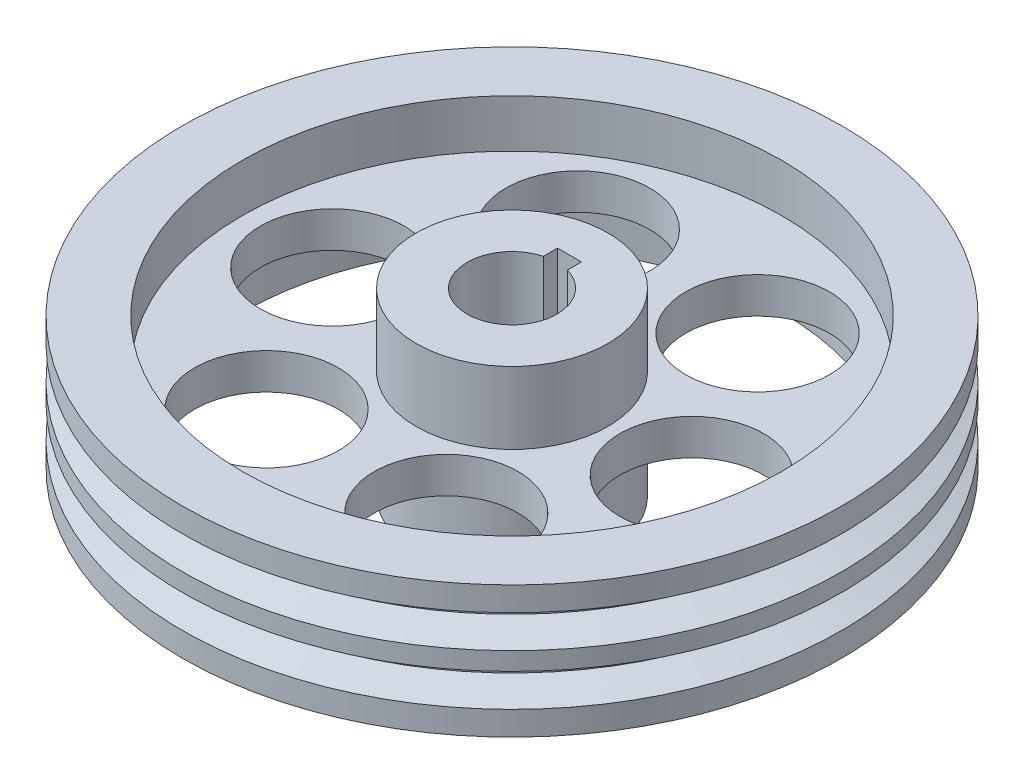
ISO-10303-21;
HEADER;
FILE_DESCRIPTION(('STEP AP214'),'2;1');
FILE_NAME('part.step','',(''),(''),'','','');
FILE_SCHEMA(('AUTOMOTIVE_DESIGN { 1 0 10303 214 1 1 1 1 }'));
ENDSEC;
DATA;
#1=APPLICATION_CONTEXT('core data for automotive mechanical design processes');
#2=APPLICATION_PROTOCOL_DEFINITION('international standard','automotive_design',2000,#1);
#3=PRODUCT_CONTEXT('',#1,'mechanical');
#4=PRODUCT('Part','Part','',(#3));
#5=PRODUCT_RELATED_PRODUCT_CATEGORY('part','',(#4));
#6=PRODUCT_DEFINITION_FORMATION('','',#4);
#7=PRODUCT_DEFINITION_CONTEXT('part definition',#1,'design');
#8=PRODUCT_DEFINITION('design','',#6,#7);
#9=PRODUCT_DEFINITION_SHAPE('','',#8);
#10=(LENGTH_UNIT() NAMED_UNIT(*) SI_UNIT(.MILLI.,.METRE.));
#11=(NAMED_UNIT(*) PLANE_ANGLE_UNIT() SI_UNIT($,.RADIAN.));
#12=(NAMED_UNIT(*) SI_UNIT($,.STERADIAN.) SOLID_ANGLE_UNIT());
#13=UNCERTAINTY_MEASURE_WITH_UNIT(LENGTH_MEASURE(1.E-05),#10,'distance_accuracy_value','');
#14=(GEOMETRIC_REPRESENTATION_CONTEXT(3) GLOBAL_UNCERTAINTY_ASSIGNED_CONTEXT((#13)) GLOBAL_UNIT_ASSIGNED_CONTEXT((#10,
#11,#12)) REPRESENTATION_CONTEXT('',''));
#15=CARTESIAN_POINT('',(0.,0.,0.));
#16=DIRECTION('',(0.,0.,1.));
#17=DIRECTION('',(1.,0.,0.));
#18=AXIS2_PLACEMENT_3D('',#15,#16,#17);
#19=CARTESIAN_POINT('',(0.,11.,0.));
#20=DIRECTION('',(0.,-1.,0.));
#21=DIRECTION('',(0.,0.,-1.));
#22=AXIS2_PLACEMENT_3D('',#19,#20,#21);
#23=CYLINDRICAL_SURFACE('',#22,55.);
#24=CARTESIAN_POINT('',(0.,11.,0.));
#25=DIRECTION('',(0.,1.,0.));
#26=DIRECTION('',(0.,0.,1.));
#27=AXIS2_PLACEMENT_3D('',#24,#25,#26);
#28=CIRCLE('',#27,55.);
#29=CARTESIAN_POINT('',(0.,11.,55.));
#30=VERTEX_POINT('',#29);
#31=EDGE_CURVE('E298',#30,#30,#28,.T.);
#32=ORIENTED_EDGE('',*,*,#31,.F.);
#33=EDGE_LOOP('',(#32));
#34=FACE_BOUND('',#33,.T.);
#35=CARTESIAN_POINT('',(0.,6.98516846383476,0.));
#36=DIRECTION('',(0.,-1.,0.));
#37=DIRECTION('',(0.,0.,-1.));
#38=AXIS2_PLACEMENT_3D('',#35,#36,#37);
#39=CIRCLE('',#38,55.);
#40=CARTESIAN_POINT('',(0.,6.98516846383476,-55.));
#41=VERTEX_POINT('',#40);
#42=EDGE_CURVE('E294',#41,#41,#39,.T.);
#43=ORIENTED_EDGE('',*,*,#42,.F.);
#44=EDGE_LOOP('',(#43));
#45=FACE_BOUND('',#44,.T.);
#46=ADVANCED_FACE('F77',(#34,#45),#23,.T.);
#47=CARTESIAN_POINT('',(0.,-11.,0.));
#48=DIRECTION('',(0.,1.,0.));
#49=DIRECTION('',(0.,0.,1.));
#50=AXIS2_PLACEMENT_3D('',#47,#48,#49);
#51=CIRCLE('',#50,55.);
#52=CARTESIAN_POINT('',(0.,-11.,55.));
#53=VERTEX_POINT('',#52);
#54=EDGE_CURVE('E296',#53,#53,#51,.T.);
#55=ORIENTED_EDGE('',*,*,#54,.T.);
#56=EDGE_LOOP('',(#55));
#57=FACE_BOUND('',#56,.T.);
#58=CARTESIAN_POINT('',(0.,-6.98516846383476,0.));
#59=DIRECTION('',(0.,-1.,0.));
#60=DIRECTION('',(0.,0.,-1.));
#61=AXIS2_PLACEMENT_3D('',#58,#59,#60);
#62=CIRCLE('',#61,55.);
#63=CARTESIAN_POINT('',(0.,-6.98516846383476,-55.));
#64=VERTEX_POINT('',#63);
#65=EDGE_CURVE('E284',#64,#64,#62,.T.);
#66=ORIENTED_EDGE('',*,*,#65,.T.);
#67=EDGE_LOOP('',(#66));
#68=FACE_BOUND('',#67,.T.);
#69=ADVANCED_FACE('F239',(#57,#68),#23,.T.);
#70=CARTESIAN_POINT('',(0.,15.,0.));
#71=DIRECTION('',(0.,-1.,0.));
#72=DIRECTION('',(0.,0.,-1.));
#73=AXIS2_PLACEMENT_3D('',#70,#71,#72);
#74=CYLINDRICAL_SURFACE('',#73,7.5);
#75=CARTESIAN_POINT('',(0.,3.,0.));
#76=DIRECTION('',(0.,1.,0.));
#77=DIRECTION('',(0.,0.,1.));
#78=AXIS2_PLACEMENT_3D('',#75,#76,#77);
#79=CIRCLE('',#78,7.5);
#80=CARTESIAN_POINT('',(-2.,3.,-7.22841614740048));
#81=VERTEX_POINT('',#80);
#82=CARTESIAN_POINT('',(2.,3.,-7.22841614740048));
#83=VERTEX_POINT('',#82);
#84=EDGE_CURVE('E181',#81,#83,#79,.T.);
#85=ORIENTED_EDGE('',*,*,#84,.F.);
#86=DIRECTION('',(0.,-1.,0.));
#87=VECTOR('',#86,1.);
#88=CARTESIAN_POINT('',(-2.,15.,-7.22841614740048));
#89=LINE('',#88,#87);
#90=CARTESIAN_POINT('',(-2.,15.,-7.22841614740048));
#91=VERTEX_POINT('',#90);
#92=EDGE_CURVE('E86',#91,#81,#89,.T.);
#93=ORIENTED_EDGE('',*,*,#92,.F.);
#94=CARTESIAN_POINT('',(0.,15.,0.));
#95=DIRECTION('',(0.,1.,0.));
#96=DIRECTION('',(0.,0.,1.));
#97=AXIS2_PLACEMENT_3D('',#94,#95,#96);
#98=CIRCLE('',#97,7.5);
#99=CARTESIAN_POINT('',(2.,15.,-7.22841614740048));
#100=VERTEX_POINT('',#99);
#101=EDGE_CURVE('E184',#91,#100,#98,.T.);
#102=ORIENTED_EDGE('',*,*,#101,.T.);
#103=DIRECTION('',(0.,-1.,0.));
#104=VECTOR('',#103,1.);
#105=CARTESIAN_POINT('',(2.,15.,-7.22841614740048));
#106=LINE('',#105,#104);
#107=EDGE_CURVE('E153',#100,#83,#106,.T.);
#108=ORIENTED_EDGE('',*,*,#107,.T.);
#109=EDGE_LOOP('',(#85,#93,#102,#108));
#110=FACE_BOUND('',#109,.T.);
#111=ADVANCED_FACE('F79',(#110),#74,.F.);
#112=CARTESIAN_POINT('',(-2.,15.,0.));
#113=DIRECTION('',(-1.,0.,0.));
#114=DIRECTION('',(0.,0.,1.));
#115=AXIS2_PLACEMENT_3D('',#112,#113,#114);
#116=PLANE('',#115);
#117=ORIENTED_EDGE('',*,*,#92,.T.);
#118=DIRECTION('',(0.,0.,-1.));
#119=VECTOR('',#118,1.);
#120=CARTESIAN_POINT('',(-2.,3.,0.));
#121=LINE('',#120,#119);
#122=CARTESIAN_POINT('',(-2.,3.,-9.6));
#123=VERTEX_POINT('',#122);
#124=EDGE_CURVE('E178',#81,#123,#121,.T.);
#125=ORIENTED_EDGE('',*,*,#124,.T.);
#126=DIRECTION('',(0.,-1.,0.));
#127=VECTOR('',#126,1.);
#128=CARTESIAN_POINT('',(-2.,15.,-9.6));
#129=LINE('',#128,#127);
#130=CARTESIAN_POINT('',(-2.,15.,-9.6));
#131=VERTEX_POINT('',#130);
#132=EDGE_CURVE('E212',#131,#123,#129,.T.);
#133=ORIENTED_EDGE('',*,*,#132,.F.);
#134=DIRECTION('',(0.,0.,-1.));
#135=VECTOR('',#134,1.);
#136=CARTESIAN_POINT('',(-2.,15.,0.));
#137=LINE('',#136,#135);
#138=EDGE_CURVE('E187',#91,#131,#137,.T.);
#139=ORIENTED_EDGE('',*,*,#138,.F.);
#140=EDGE_LOOP('',(#117,#125,#133,#139));
#141=FACE_BOUND('',#140,.T.);
#142=ADVANCED_FACE('F232',(#141),#116,.F.);
#143=CARTESIAN_POINT('',(0.,15.,-9.6));
#144=DIRECTION('',(0.,0.,-1.));
#145=DIRECTION('',(-1.,0.,0.));
#146=AXIS2_PLACEMENT_3D('',#143,#144,#145);
#147=PLANE('',#146);
#148=ORIENTED_EDGE('',*,*,#132,.T.);
#149=DIRECTION('',(1.,0.,0.));
#150=VECTOR('',#149,1.);
#151=CARTESIAN_POINT('',(0.,3.,-9.6));
#152=LINE('',#151,#150);
#153=CARTESIAN_POINT('',(2.,3.,-9.6));
#154=VERTEX_POINT('',#153);
#155=EDGE_CURVE('E175',#123,#154,#152,.T.);
#156=ORIENTED_EDGE('',*,*,#155,.T.);
#157=DIRECTION('',(0.,-1.,0.));
#158=VECTOR('',#157,1.);
#159=CARTESIAN_POINT('',(2.,15.,-9.6));
#160=LINE('',#159,#158);
#161=CARTESIAN_POINT('',(2.,15.,-9.6));
#162=VERTEX_POINT('',#161);
#163=EDGE_CURVE('E208',#162,#154,#160,.T.);
#164=ORIENTED_EDGE('',*,*,#163,.F.);
#165=DIRECTION('',(1.,0.,0.));
#166=VECTOR('',#165,1.);
#167=CARTESIAN_POINT('',(0.,15.,-9.6));
#168=LINE('',#167,#166);
#169=EDGE_CURVE('E190',#131,#162,#168,.T.);
#170=ORIENTED_EDGE('',*,*,#169,.F.);
#171=EDGE_LOOP('',(#148,#156,#164,#170));
#172=FACE_BOUND('',#171,.T.);
#173=ADVANCED_FACE('F227',(#172),#147,.F.);
#174=CARTESIAN_POINT('',(2.,15.,0.));
#175=DIRECTION('',(1.,0.,0.));
#176=DIRECTION('',(0.,0.,-1.));
#177=AXIS2_PLACEMENT_3D('',#174,#175,#176);
#178=PLANE('',#177);
#179=ORIENTED_EDGE('',*,*,#163,.T.);
#180=DIRECTION('',(0.,0.,1.));
#181=VECTOR('',#180,1.);
#182=CARTESIAN_POINT('',(2.,3.,0.));
#183=LINE('',#182,#181);
#184=EDGE_CURVE('E172',#154,#83,#183,.T.);
#185=ORIENTED_EDGE('',*,*,#184,.T.);
#186=ORIENTED_EDGE('',*,*,#107,.F.);
#187=DIRECTION('',(0.,0.,1.));
#188=VECTOR('',#187,1.);
#189=CARTESIAN_POINT('',(2.,15.,0.));
#190=LINE('',#189,#188);
#191=EDGE_CURVE('E192',#162,#100,#190,.T.);
#192=ORIENTED_EDGE('',*,*,#191,.F.);
#193=EDGE_LOOP('',(#179,#185,#186,#192));
#194=FACE_BOUND('',#193,.T.);
#195=ADVANCED_FACE('F235',(#194),#178,.F.);
#196=CARTESIAN_POINT('',(0.,15.,0.));
#197=DIRECTION('',(0.,-1.,0.));
#198=DIRECTION('',(0.,0.,-1.));
#199=AXIS2_PLACEMENT_3D('',#196,#197,#198);
#200=CYLINDRICAL_SURFACE('',#199,16.);
#201=CARTESIAN_POINT('',(0.,3.,0.));
#202=DIRECTION('',(0.,1.,0.));
#203=DIRECTION('',(0.,0.,1.));
#204=AXIS2_PLACEMENT_3D('',#201,#202,#203);
#205=CIRCLE('',#204,16.);
#206=CARTESIAN_POINT('',(0.,3.,16.));
#207=VERTEX_POINT('',#206);
#208=EDGE_CURVE('E81',#207,#207,#205,.T.);
#209=ORIENTED_EDGE('',*,*,#208,.T.);
#210=EDGE_LOOP('',(#209));
#211=FACE_BOUND('',#210,.T.);
#212=CARTESIAN_POINT('',(0.,15.,0.));
#213=DIRECTION('',(0.,1.,0.));
#214=DIRECTION('',(0.,0.,1.));
#215=AXIS2_PLACEMENT_3D('',#212,#213,#214);
#216=CIRCLE('',#215,16.);
#217=CARTESIAN_POINT('',(0.,15.,16.));
#218=VERTEX_POINT('',#217);
#219=EDGE_CURVE('E154',#218,#218,#216,.T.);
#220=ORIENTED_EDGE('',*,*,#219,.F.);
#221=EDGE_LOOP('',(#220));
#222=FACE_BOUND('',#221,.T.);
#223=ADVANCED_FACE('F368',(#211,#222),#200,.T.);
#224=CARTESIAN_POINT('',(0.,15.,0.));
#225=DIRECTION('',(0.,1.,0.));
#226=DIRECTION('',(0.,0.,1.));
#227=AXIS2_PLACEMENT_3D('',#224,#225,#226);
#228=PLANE('',#227);
#229=ORIENTED_EDGE('',*,*,#101,.F.);
#230=ORIENTED_EDGE('',*,*,#138,.T.);
#231=ORIENTED_EDGE('',*,*,#169,.T.);
#232=ORIENTED_EDGE('',*,*,#191,.T.);
#233=EDGE_LOOP('',(#229,#230,#231,#232));
#234=FACE_BOUND('',#233,.T.);
#235=ORIENTED_EDGE('',*,*,#219,.T.);
#236=EDGE_LOOP('',(#235));
#237=FACE_BOUND('',#236,.T.);
#238=ADVANCED_FACE('F364',(#234,#237),#228,.T.);
#239=CARTESIAN_POINT('',(15.0000000000001,3.,-25.9807621135331));
#240=DIRECTION('',(0.,-1.,0.));
#241=DIRECTION('',(0.,0.,-1.));
#242=AXIS2_PLACEMENT_3D('',#239,#240,#241);
#243=CYLINDRICAL_SURFACE('',#242,12.);
#244=CARTESIAN_POINT('',(15.0000000000001,3.,-25.9807621135331));
#245=DIRECTION('',(0.,1.,0.));
#246=DIRECTION('',(0.,0.,1.));
#247=AXIS2_PLACEMENT_3D('',#244,#245,#246);
#248=CIRCLE('',#247,12.);
#249=CARTESIAN_POINT('',(15.0000000000001,3.,-13.9807621135331));
#250=VERTEX_POINT('',#249);
#251=EDGE_CURVE('E307',#250,#250,#248,.T.);
#252=ORIENTED_EDGE('',*,*,#251,.T.);
#253=EDGE_LOOP('',(#252));
#254=FACE_BOUND('',#253,.T.);
#255=CARTESIAN_POINT('',(15.0000000000001,-3.,-25.9807621135331));
#256=DIRECTION('',(0.,1.,0.));
#257=DIRECTION('',(0.,0.,1.));
#258=AXIS2_PLACEMENT_3D('',#255,#256,#257);
#259=CIRCLE('',#258,12.);
#260=CARTESIAN_POINT('',(15.0000000000001,-3.,-13.9807621135331));
#261=VERTEX_POINT('',#260);
#262=EDGE_CURVE('E306',#261,#261,#259,.T.);
#263=ORIENTED_EDGE('',*,*,#262,.F.);
#264=EDGE_LOOP('',(#263));
#265=FACE_BOUND('',#264,.T.);
#266=ADVANCED_FACE('F367',(#254,#265),#243,.F.);
#267=CARTESIAN_POINT('',(30.,3.,2.09488880330588E-13));
#268=DIRECTION('',(0.,-1.,0.));
#269=DIRECTION('',(0.,0.,-1.));
#270=AXIS2_PLACEMENT_3D('',#267,#268,#269);
#271=CYLINDRICAL_SURFACE('',#270,12.);
#272=CARTESIAN_POINT('',(30.,3.,2.09488880330588E-13));
#273=DIRECTION('',(0.,1.,0.));
#274=DIRECTION('',(0.,0.,1.));
#275=AXIS2_PLACEMENT_3D('',#272,#273,#274);
#276=CIRCLE('',#275,12.);
#277=CARTESIAN_POINT('',(30.,3.,12.0000000000002));
#278=VERTEX_POINT('',#277);
#279=EDGE_CURVE('E313',#278,#278,#276,.T.);
#280=ORIENTED_EDGE('',*,*,#279,.T.);
#281=EDGE_LOOP('',(#280));
#282=FACE_BOUND('',#281,.T.);
#283=CARTESIAN_POINT('',(30.,-3.,2.09488880330588E-13));
#284=DIRECTION('',(0.,1.,0.));
#285=DIRECTION('',(0.,0.,1.));
#286=AXIS2_PLACEMENT_3D('',#283,#284,#285);
#287=CIRCLE('',#286,12.);
#288=CARTESIAN_POINT('',(30.,-3.,12.0000000000002));
#289=VERTEX_POINT('',#288);
#290=EDGE_CURVE('E310',#289,#289,#287,.T.);
#291=ORIENTED_EDGE('',*,*,#290,.F.);
#292=EDGE_LOOP('',(#291));
#293=FACE_BOUND('',#292,.T.);
#294=ADVANCED_FACE('F592',(#282,#293),#271,.F.);
#295=CARTESIAN_POINT('',(14.9999999999998,3.,25.9807621135333));
#296=DIRECTION('',(0.,-1.,0.));
#297=DIRECTION('',(0.,0.,-1.));
#298=AXIS2_PLACEMENT_3D('',#295,#296,#297);
#299=CYLINDRICAL_SURFACE('',#298,12.);
#300=CARTESIAN_POINT('',(14.9999999999998,3.,25.9807621135333));
#301=DIRECTION('',(0.,1.,0.));
#302=DIRECTION('',(0.,0.,1.));
#303=AXIS2_PLACEMENT_3D('',#300,#301,#302);
#304=CIRCLE('',#303,12.);
#305=CARTESIAN_POINT('',(14.9999999999998,3.,37.9807621135333));
#306=VERTEX_POINT('',#305);
#307=EDGE_CURVE('E319',#306,#306,#304,.T.);
#308=ORIENTED_EDGE('',*,*,#307,.T.);
#309=EDGE_LOOP('',(#308));
#310=FACE_BOUND('',#309,.T.);
#311=CARTESIAN_POINT('',(14.9999999999998,-3.,25.9807621135333));
#312=DIRECTION('',(0.,1.,0.));
#313=DIRECTION('',(0.,0.,1.));
#314=AXIS2_PLACEMENT_3D('',#311,#312,#313);
#315=CIRCLE('',#314,12.);
#316=CARTESIAN_POINT('',(14.9999999999998,-3.,37.9807621135333));
#317=VERTEX_POINT('',#316);
#318=EDGE_CURVE('E316',#317,#317,#315,.T.);
#319=ORIENTED_EDGE('',*,*,#318,.F.);
#320=EDGE_LOOP('',(#319));
#321=FACE_BOUND('',#320,.T.);
#322=ADVANCED_FACE('F583',(#310,#321),#299,.F.);
#323=CARTESIAN_POINT('',(-15.0000000000003,3.,25.980762113533));
#324=DIRECTION('',(0.,-1.,0.));
#325=DIRECTION('',(0.,0.,-1.));
#326=AXIS2_PLACEMENT_3D('',#323,#324,#325);
#327=CYLINDRICAL_SURFACE('',#326,12.);
#328=CARTESIAN_POINT('',(-15.0000000000003,3.,25.980762113533));
#329=DIRECTION('',(0.,1.,0.));
#330=DIRECTION('',(0.,0.,1.));
#331=AXIS2_PLACEMENT_3D('',#328,#329,#330);
#332=CIRCLE('',#331,12.);
#333=CARTESIAN_POINT('',(-15.0000000000003,3.,37.980762113533));
#334=VERTEX_POINT('',#333);
#335=EDGE_CURVE('E325',#334,#334,#332,.T.);
#336=ORIENTED_EDGE('',*,*,#335,.T.);
#337=EDGE_LOOP('',(#336));
#338=FACE_BOUND('',#337,.T.);
#339=CARTESIAN_POINT('',(-15.0000000000003,-3.,25.980762113533));
#340=DIRECTION('',(0.,1.,0.));
#341=DIRECTION('',(0.,0.,1.));
#342=AXIS2_PLACEMENT_3D('',#339,#340,#341);
#343=CIRCLE('',#342,12.);
#344=CARTESIAN_POINT('',(-15.0000000000003,-3.,37.980762113533));
#345=VERTEX_POINT('',#344);
#346=EDGE_CURVE('E322',#345,#345,#343,.T.);
#347=ORIENTED_EDGE('',*,*,#346,.F.);
#348=EDGE_LOOP('',(#347));
#349=FACE_BOUND('',#348,.T.);
#350=ADVANCED_FACE('F355',(#338,#349),#327,.F.);
#351=CARTESIAN_POINT('',(-14.9999999999999,3.,-25.9807621135332));
#352=DIRECTION('',(0.,-1.,0.));
#353=DIRECTION('',(0.,0.,-1.));
#354=AXIS2_PLACEMENT_3D('',#351,#352,#353);
#355=CYLINDRICAL_SURFACE('',#354,12.);
#356=CARTESIAN_POINT('',(-14.9999999999999,3.,-25.9807621135332));
#357=DIRECTION('',(0.,1.,0.));
#358=DIRECTION('',(0.,0.,1.));
#359=AXIS2_PLACEMENT_3D('',#356,#357,#358);
#360=CIRCLE('',#359,12.);
#361=CARTESIAN_POINT('',(-14.9999999999999,3.,-13.9807621135332));
#362=VERTEX_POINT('',#361);
#363=EDGE_CURVE('E331',#362,#362,#360,.T.);
#364=ORIENTED_EDGE('',*,*,#363,.T.);
#365=EDGE_LOOP('',(#364));
#366=FACE_BOUND('',#365,.T.);
#367=CARTESIAN_POINT('',(-14.9999999999999,-3.,-25.9807621135332));
#368=DIRECTION('',(0.,1.,0.));
#369=DIRECTION('',(0.,0.,1.));
#370=AXIS2_PLACEMENT_3D('',#367,#368,#369);
#371=CIRCLE('',#370,12.);
#372=CARTESIAN_POINT('',(-14.9999999999999,-3.,-13.9807621135332));
#373=VERTEX_POINT('',#372);
#374=EDGE_CURVE('E328',#373,#373,#371,.T.);
#375=ORIENTED_EDGE('',*,*,#374,.F.);
#376=EDGE_LOOP('',(#375));
#377=FACE_BOUND('',#376,.T.);
#378=ADVANCED_FACE('F346',(#366,#377),#355,.F.);
#379=CARTESIAN_POINT('',(-30.,3.,0.));
#380=DIRECTION('',(0.,-1.,0.));
#381=DIRECTION('',(0.,0.,-1.));
#382=AXIS2_PLACEMENT_3D('',#379,#380,#381);
#383=CYLINDRICAL_SURFACE('',#382,12.);
#384=CARTESIAN_POINT('',(-30.,3.,0.));
#385=DIRECTION('',(0.,1.,0.));
#386=DIRECTION('',(0.,0.,1.));
#387=AXIS2_PLACEMENT_3D('',#384,#385,#386);
#388=CIRCLE('',#387,12.);
#389=CARTESIAN_POINT('',(-30.,3.,12.));
#390=VERTEX_POINT('',#389);
#391=EDGE_CURVE('E167',#390,#390,#388,.T.);
#392=ORIENTED_EDGE('',*,*,#391,.T.);
#393=EDGE_LOOP('',(#392));
#394=FACE_BOUND('',#393,.T.);
#395=CARTESIAN_POINT('',(-30.,-3.,0.));
#396=DIRECTION('',(0.,1.,0.));
#397=DIRECTION('',(0.,0.,1.));
#398=AXIS2_PLACEMENT_3D('',#395,#396,#397);
#399=CIRCLE('',#398,12.);
#400=CARTESIAN_POINT('',(-30.,-3.,12.));
#401=VERTEX_POINT('',#400);
#402=EDGE_CURVE('E334',#401,#401,#399,.T.);
#403=ORIENTED_EDGE('',*,*,#402,.F.);
#404=EDGE_LOOP('',(#403));
#405=FACE_BOUND('',#404,.T.);
#406=ADVANCED_FACE('F344',(#394,#405),#383,.F.);
#407=CARTESIAN_POINT('',(0.,-3.,0.));
#408=DIRECTION('',(0.,1.,0.));
#409=DIRECTION('',(0.,0.,1.));
#410=AXIS2_PLACEMENT_3D('',#407,#408,#409);
#411=PLANE('',#410);
#412=CARTESIAN_POINT('',(0.,-3.,0.));
#413=DIRECTION('',(0.,1.,0.));
#414=DIRECTION('',(0.,0.,1.));
#415=AXIS2_PLACEMENT_3D('',#412,#413,#414);
#416=CIRCLE('',#415,16.);
#417=CARTESIAN_POINT('',(0.,-3.,16.));
#418=VERTEX_POINT('',#417);
#419=EDGE_CURVE('E12',#418,#418,#416,.T.);
#420=ORIENTED_EDGE('',*,*,#419,.T.);
#421=EDGE_LOOP('',(#420));
#422=FACE_BOUND('',#421,.T.);
#423=CARTESIAN_POINT('',(0.,-3.,0.));
#424=DIRECTION('',(0.,1.,0.));
#425=DIRECTION('',(0.,0.,1.));
#426=AXIS2_PLACEMENT_3D('',#423,#424,#425);
#427=CIRCLE('',#426,45.);
#428=CARTESIAN_POINT('',(0.,-3.,45.));
#429=VERTEX_POINT('',#428);
#430=EDGE_CURVE('E163',#429,#429,#427,.T.);
#431=ORIENTED_EDGE('',*,*,#430,.F.);
#432=EDGE_LOOP('',(#431));
#433=FACE_BOUND('',#432,.T.);
#434=ORIENTED_EDGE('',*,*,#402,.T.);
#435=EDGE_LOOP('',(#434));
#436=FACE_BOUND('',#435,.T.);
#437=ORIENTED_EDGE('',*,*,#374,.T.);
#438=EDGE_LOOP('',(#437));
#439=FACE_BOUND('',#438,.T.);
#440=ORIENTED_EDGE('',*,*,#346,.T.);
#441=EDGE_LOOP('',(#440));
#442=FACE_BOUND('',#441,.T.);
#443=ORIENTED_EDGE('',*,*,#318,.T.);
#444=EDGE_LOOP('',(#443));
#445=FACE_BOUND('',#444,.T.);
#446=ORIENTED_EDGE('',*,*,#290,.T.);
#447=EDGE_LOOP('',(#446));
#448=FACE_BOUND('',#447,.T.);
#449=ORIENTED_EDGE('',*,*,#262,.T.);
#450=EDGE_LOOP('',(#449));
#451=FACE_BOUND('',#450,.T.);
#452=ADVANCED_FACE('F341',(#422,#433,#436,#439,#442,#445,#448,#451),#411,.F.);
#453=CARTESIAN_POINT('',(0.,3.,0.));
#454=DIRECTION('',(0.,1.,0.));
#455=DIRECTION('',(0.,0.,1.));
#456=AXIS2_PLACEMENT_3D('',#453,#454,#455);
#457=PLANE('',#456);
#458=ORIENTED_EDGE('',*,*,#208,.F.);
#459=EDGE_LOOP('',(#458));
#460=FACE_BOUND('',#459,.T.);
#461=ORIENTED_EDGE('',*,*,#279,.F.);
#462=EDGE_LOOP('',(#461));
#463=FACE_BOUND('',#462,.T.);
#464=ORIENTED_EDGE('',*,*,#335,.F.);
#465=EDGE_LOOP('',(#464));
#466=FACE_BOUND('',#465,.T.);
#467=ORIENTED_EDGE('',*,*,#391,.F.);
#468=EDGE_LOOP('',(#467));
#469=FACE_BOUND('',#468,.T.);
#470=CARTESIAN_POINT('',(0.,3.,0.));
#471=DIRECTION('',(0.,1.,0.));
#472=DIRECTION('',(0.,0.,1.));
#473=AXIS2_PLACEMENT_3D('',#470,#471,#472);
#474=CIRCLE('',#473,45.);
#475=CARTESIAN_POINT('',(0.,3.,45.));
#476=VERTEX_POINT('',#475);
#477=EDGE_CURVE('E301',#476,#476,#474,.F.);
#478=ORIENTED_EDGE('',*,*,#477,.F.);
#479=EDGE_LOOP('',(#478));
#480=FACE_BOUND('',#479,.T.);
#481=ORIENTED_EDGE('',*,*,#363,.F.);
#482=EDGE_LOOP('',(#481));
#483=FACE_BOUND('',#482,.T.);
#484=ORIENTED_EDGE('',*,*,#307,.F.);
#485=EDGE_LOOP('',(#484));
#486=FACE_BOUND('',#485,.T.);
#487=ORIENTED_EDGE('',*,*,#251,.F.);
#488=EDGE_LOOP('',(#487));
#489=FACE_BOUND('',#488,.T.);
#490=ADVANCED_FACE('F233',(#460,#463,#466,#469,#480,#483,#486,#489),#457,.T.);
#491=DIRECTION('',(0.,0.,1.));
#492=VECTOR('',#491,1.);
#493=CARTESIAN_POINT('',(2.,-3.,0.));
#494=LINE('',#493,#492);
#495=CARTESIAN_POINT('',(2.,-3.,-9.6));
#496=VERTEX_POINT('',#495);
#497=CARTESIAN_POINT('',(2.,-3.,-7.22841614740048));
#498=VERTEX_POINT('',#497);
#499=EDGE_CURVE('E147',#496,#498,#494,.T.);
#500=ORIENTED_EDGE('',*,*,#499,.F.);
#501=CARTESIAN_POINT('',(2.,-15.,-9.6));
#502=VERTEX_POINT('',#501);
#503=EDGE_CURVE('E207',#496,#502,#160,.T.);
#504=ORIENTED_EDGE('',*,*,#503,.T.);
#505=DIRECTION('',(0.,0.,1.));
#506=VECTOR('',#505,1.);
#507=CARTESIAN_POINT('',(2.,-15.,0.));
#508=LINE('',#507,#506);
#509=CARTESIAN_POINT('',(2.,-15.,-7.22841614740048));
#510=VERTEX_POINT('',#509);
#511=EDGE_CURVE('E149',#502,#510,#508,.T.);
#512=ORIENTED_EDGE('',*,*,#511,.T.);
#513=EDGE_CURVE('E143',#498,#510,#106,.T.);
#514=ORIENTED_EDGE('',*,*,#513,.F.);
#515=EDGE_LOOP('',(#500,#504,#512,#514));
#516=FACE_BOUND('',#515,.T.);
#517=ADVANCED_FACE('F145',(#516),#178,.F.);
#518=DIRECTION('',(1.,0.,0.));
#519=VECTOR('',#518,1.);
#520=CARTESIAN_POINT('',(0.,-3.,-9.6));
#521=LINE('',#520,#519);
#522=CARTESIAN_POINT('',(-2.,-3.,-9.6));
#523=VERTEX_POINT('',#522);
#524=EDGE_CURVE('E101',#523,#496,#521,.T.);
#525=ORIENTED_EDGE('',*,*,#524,.F.);
#526=CARTESIAN_POINT('',(-2.,-15.,-9.6));
#527=VERTEX_POINT('',#526);
#528=EDGE_CURVE('E211',#523,#527,#129,.T.);
#529=ORIENTED_EDGE('',*,*,#528,.T.);
#530=DIRECTION('',(1.,0.,0.));
#531=VECTOR('',#530,1.);
#532=CARTESIAN_POINT('',(0.,-15.,-9.6));
#533=LINE('',#532,#531);
#534=EDGE_CURVE('E200',#527,#502,#533,.T.);
#535=ORIENTED_EDGE('',*,*,#534,.T.);
#536=ORIENTED_EDGE('',*,*,#503,.F.);
#537=EDGE_LOOP('',(#525,#529,#535,#536));
#538=FACE_BOUND('',#537,.T.);
#539=ADVANCED_FACE('F224',(#538),#147,.F.);
#540=DIRECTION('',(0.,0.,-1.));
#541=VECTOR('',#540,1.);
#542=CARTESIAN_POINT('',(-2.,-3.,0.));
#543=LINE('',#542,#541);
#544=CARTESIAN_POINT('',(-2.,-3.,-7.22841614740048));
#545=VERTEX_POINT('',#544);
#546=EDGE_CURVE('E93',#545,#523,#543,.T.);
#547=ORIENTED_EDGE('',*,*,#546,.F.);
#548=CARTESIAN_POINT('',(-2.,-15.,-7.22841614740048));
#549=VERTEX_POINT('',#548);
#550=EDGE_CURVE('E159',#545,#549,#89,.T.);
#551=ORIENTED_EDGE('',*,*,#550,.T.);
#552=DIRECTION('',(0.,0.,-1.));
#553=VECTOR('',#552,1.);
#554=CARTESIAN_POINT('',(-2.,-15.,0.));
#555=LINE('',#554,#553);
#556=EDGE_CURVE('E197',#549,#527,#555,.T.);
#557=ORIENTED_EDGE('',*,*,#556,.T.);
#558=ORIENTED_EDGE('',*,*,#528,.F.);
#559=EDGE_LOOP('',(#547,#551,#557,#558));
#560=FACE_BOUND('',#559,.T.);
#561=ADVANCED_FACE('F219',(#560),#116,.F.);
#562=ORIENTED_EDGE('',*,*,#550,.F.);
#563=CARTESIAN_POINT('',(0.,-3.,0.));
#564=DIRECTION('',(0.,1.,0.));
#565=DIRECTION('',(0.,0.,1.));
#566=AXIS2_PLACEMENT_3D('',#563,#564,#565);
#567=CIRCLE('',#566,7.5);
#568=EDGE_CURVE('E157',#545,#498,#567,.T.);
#569=ORIENTED_EDGE('',*,*,#568,.T.);
#570=ORIENTED_EDGE('',*,*,#513,.T.);
#571=CARTESIAN_POINT('',(0.,-15.,0.));
#572=DIRECTION('',(0.,1.,0.));
#573=DIRECTION('',(0.,0.,1.));
#574=AXIS2_PLACEMENT_3D('',#571,#572,#573);
#575=CIRCLE('',#574,7.5);
#576=EDGE_CURVE('E183',#549,#510,#575,.T.);
#577=ORIENTED_EDGE('',*,*,#576,.F.);
#578=EDGE_LOOP('',(#562,#569,#570,#577));
#579=FACE_BOUND('',#578,.T.);
#580=ADVANCED_FACE('F158',(#579),#74,.F.);
#581=CARTESIAN_POINT('',(0.,-15.,0.));
#582=DIRECTION('',(0.,1.,0.));
#583=DIRECTION('',(0.,0.,1.));
#584=AXIS2_PLACEMENT_3D('',#581,#582,#583);
#585=PLANE('',#584);
#586=ORIENTED_EDGE('',*,*,#576,.T.);
#587=ORIENTED_EDGE('',*,*,#511,.F.);
#588=ORIENTED_EDGE('',*,*,#534,.F.);
#589=ORIENTED_EDGE('',*,*,#556,.F.);
#590=EDGE_LOOP('',(#586,#587,#588,#589));
#591=FACE_BOUND('',#590,.T.);
#592=CARTESIAN_POINT('',(0.,-15.,0.));
#593=DIRECTION('',(0.,1.,0.));
#594=DIRECTION('',(0.,0.,1.));
#595=AXIS2_PLACEMENT_3D('',#592,#593,#594);
#596=CIRCLE('',#595,16.);
#597=CARTESIAN_POINT('',(0.,-15.,16.));
#598=VERTEX_POINT('',#597);
#599=EDGE_CURVE('E188',#598,#598,#596,.T.);
#600=ORIENTED_EDGE('',*,*,#599,.F.);
#601=EDGE_LOOP('',(#600));
#602=FACE_BOUND('',#601,.T.);
#603=ADVANCED_FACE('F222',(#591,#602),#585,.F.);
#604=ORIENTED_EDGE('',*,*,#599,.T.);
#605=EDGE_LOOP('',(#604));
#606=FACE_BOUND('',#605,.T.);
#607=ORIENTED_EDGE('',*,*,#419,.F.);
#608=EDGE_LOOP('',(#607));
#609=FACE_BOUND('',#608,.T.);
#610=ADVANCED_FACE('F372',(#606,#609),#200,.T.);
#611=ORIENTED_EDGE('',*,*,#568,.F.);
#612=ORIENTED_EDGE('',*,*,#546,.T.);
#613=ORIENTED_EDGE('',*,*,#524,.T.);
#614=ORIENTED_EDGE('',*,*,#499,.T.);
#615=EDGE_LOOP('',(#611,#612,#613,#614));
#616=FACE_BOUND('',#615,.T.);
#617=ADVANCED_FACE('F162',(#616),#411,.F.);
#618=ORIENTED_EDGE('',*,*,#124,.F.);
#619=ORIENTED_EDGE('',*,*,#84,.T.);
#620=ORIENTED_EDGE('',*,*,#184,.F.);
#621=ORIENTED_EDGE('',*,*,#155,.F.);
#622=EDGE_LOOP('',(#618,#619,#620,#621));
#623=FACE_BOUND('',#622,.T.);
#624=ADVANCED_FACE('F362',(#623),#457,.T.);
#625=CARTESIAN_POINT('',(0.,11.,0.));
#626=DIRECTION('',(0.,-1.,0.));
#627=DIRECTION('',(0.,0.,-1.));
#628=AXIS2_PLACEMENT_3D('',#625,#626,#627);
#629=CYLINDRICAL_SURFACE('',#628,45.);
#630=CARTESIAN_POINT('',(0.,-11.,0.));
#631=DIRECTION('',(0.,1.,0.));
#632=DIRECTION('',(0.,0.,1.));
#633=AXIS2_PLACEMENT_3D('',#630,#631,#632);
#634=CIRCLE('',#633,45.);
#635=CARTESIAN_POINT('',(0.,-11.,45.));
#636=VERTEX_POINT('',#635);
#637=EDGE_CURVE('E273',#636,#636,#634,.T.);
#638=ORIENTED_EDGE('',*,*,#637,.F.);
#639=EDGE_LOOP('',(#638));
#640=FACE_BOUND('',#639,.T.);
#641=ORIENTED_EDGE('',*,*,#430,.T.);
#642=EDGE_LOOP('',(#641));
#643=FACE_BOUND('',#642,.T.);
#644=ADVANCED_FACE('F420',(#640,#643),#629,.F.);
#645=CARTESIAN_POINT('',(0.,11.,0.));
#646=DIRECTION('',(0.,1.,0.));
#647=DIRECTION('',(0.,0.,1.));
#648=AXIS2_PLACEMENT_3D('',#645,#646,#647);
#649=PLANE('',#648);
#650=ORIENTED_EDGE('',*,*,#31,.T.);
#651=EDGE_LOOP('',(#650));
#652=FACE_BOUND('',#651,.T.);
#653=CARTESIAN_POINT('',(0.,11.,0.));
#654=DIRECTION('',(0.,1.,0.));
#655=DIRECTION('',(0.,0.,1.));
#656=AXIS2_PLACEMENT_3D('',#653,#654,#655);
#657=CIRCLE('',#656,45.);
#658=CARTESIAN_POINT('',(0.,11.,45.));
#659=VERTEX_POINT('',#658);
#660=EDGE_CURVE('E277',#659,#659,#657,.T.);
#661=ORIENTED_EDGE('',*,*,#660,.F.);
#662=EDGE_LOOP('',(#661));
#663=FACE_BOUND('',#662,.T.);
#664=ADVANCED_FACE('F426',(#652,#663),#649,.T.);
#665=CARTESIAN_POINT('',(0.,-11.,0.));
#666=DIRECTION('',(0.,1.,0.));
#667=DIRECTION('',(0.,0.,1.));
#668=AXIS2_PLACEMENT_3D('',#665,#666,#667);
#669=PLANE('',#668);
#670=ORIENTED_EDGE('',*,*,#54,.F.);
#671=EDGE_LOOP('',(#670));
#672=FACE_BOUND('',#671,.T.);
#673=ORIENTED_EDGE('',*,*,#637,.T.);
#674=EDGE_LOOP('',(#673));
#675=FACE_BOUND('',#674,.T.);
#676=ADVANCED_FACE('F435',(#672,#675),#669,.F.);
#677=ORIENTED_EDGE('',*,*,#477,.T.);
#678=EDGE_LOOP('',(#677));
#679=FACE_BOUND('',#678,.T.);
#680=ORIENTED_EDGE('',*,*,#660,.T.);
#681=EDGE_LOOP('',(#680));
#682=FACE_BOUND('',#681,.T.);
#683=ADVANCED_FACE('F429',(#679,#682),#629,.F.);
#684=CARTESIAN_POINT('',(0.,-3.22163806644831,0.));
#685=DIRECTION('',(0.,1.,0.));
#686=DIRECTION('',(0.,0.,1.));
#687=AXIS2_PLACEMENT_3D('',#684,#685,#686);
#688=CONICAL_SURFACE('',#687,50.,1.23918376891598);
#689=CARTESIAN_POINT('',(0.,-1.5,0.));
#690=DIRECTION('',(0.,-1.,0.));
#691=DIRECTION('',(0.,0.,-1.));
#692=AXIS2_PLACEMENT_3D('',#689,#690,#691);
#693=CIRCLE('',#692,55.);
#694=CARTESIAN_POINT('',(0.,-1.5,-55.));
#695=VERTEX_POINT('',#694);
#696=EDGE_CURVE('E268',#695,#695,#693,.T.);
#697=ORIENTED_EDGE('',*,*,#696,.T.);
#698=EDGE_LOOP('',(#697));
#699=FACE_BOUND('',#698,.T.);
#700=CARTESIAN_POINT('',(0.,-3.22163806644831,0.));
#701=DIRECTION('',(0.,-1.,0.));
#702=DIRECTION('',(0.,0.,-1.));
#703=AXIS2_PLACEMENT_3D('',#700,#701,#702);
#704=CIRCLE('',#703,50.);
#705=CARTESIAN_POINT('',(0.,-3.22163806644831,-50.));
#706=VERTEX_POINT('',#705);
#707=EDGE_CURVE('E290',#706,#706,#704,.T.);
#708=ORIENTED_EDGE('',*,*,#707,.F.);
#709=EDGE_LOOP('',(#708));
#710=FACE_BOUND('',#709,.T.);
#711=ADVANCED_FACE('F449',(#699,#710),#688,.T.);
#712=CARTESIAN_POINT('',(0.,-16.5,0.));
#713=DIRECTION('',(0.,-1.,0.));
#714=DIRECTION('',(0.,0.,-1.));
#715=AXIS2_PLACEMENT_3D('',#712,#713,#714);
#716=CYLINDRICAL_SURFACE('',#715,50.);
#717=ORIENTED_EDGE('',*,*,#707,.T.);
#718=EDGE_LOOP('',(#717));
#719=FACE_BOUND('',#718,.T.);
#720=CARTESIAN_POINT('',(0.,-5.26353039738645,0.));
#721=DIRECTION('',(0.,-1.,0.));
#722=DIRECTION('',(0.,0.,-1.));
#723=AXIS2_PLACEMENT_3D('',#720,#721,#722);
#724=CIRCLE('',#723,50.);
#725=CARTESIAN_POINT('',(0.,-5.26353039738645,-50.));
#726=VERTEX_POINT('',#725);
#727=EDGE_CURVE('E287',#726,#726,#724,.T.);
#728=ORIENTED_EDGE('',*,*,#727,.F.);
#729=EDGE_LOOP('',(#728));
#730=FACE_BOUND('',#729,.T.);
#731=ADVANCED_FACE('F262',(#719,#730),#716,.T.);
#732=CARTESIAN_POINT('',(0.,-6.98516846383476,0.));
#733=DIRECTION('',(0.,-1.,0.));
#734=DIRECTION('',(0.,0.,-1.));
#735=AXIS2_PLACEMENT_3D('',#732,#733,#734);
#736=CONICAL_SURFACE('',#735,55.,1.23918376891598);
#737=ORIENTED_EDGE('',*,*,#727,.T.);
#738=EDGE_LOOP('',(#737));
#739=FACE_BOUND('',#738,.T.);
#740=ORIENTED_EDGE('',*,*,#65,.F.);
#741=EDGE_LOOP('',(#740));
#742=FACE_BOUND('',#741,.T.);
#743=ADVANCED_FACE('F253',(#739,#742),#736,.T.);
#744=ORIENTED_EDGE('',*,*,#696,.F.);
#745=EDGE_LOOP('',(#744));
#746=FACE_BOUND('',#745,.T.);
#747=CARTESIAN_POINT('',(0.,1.5,0.));
#748=DIRECTION('',(0.,-1.,0.));
#749=DIRECTION('',(0.,0.,-1.));
#750=AXIS2_PLACEMENT_3D('',#747,#748,#749);
#751=CIRCLE('',#750,55.);
#752=CARTESIAN_POINT('',(0.,1.5,-55.));
#753=VERTEX_POINT('',#752);
#754=EDGE_CURVE('E271',#753,#753,#751,.T.);
#755=ORIENTED_EDGE('',*,*,#754,.T.);
#756=EDGE_LOOP('',(#755));
#757=FACE_BOUND('',#756,.T.);
#758=ADVANCED_FACE('F242',(#746,#757),#23,.T.);
#759=CARTESIAN_POINT('',(0.,1.5,0.));
#760=DIRECTION('',(0.,-1.,0.));
#761=DIRECTION('',(0.,0.,-1.));
#762=AXIS2_PLACEMENT_3D('',#759,#760,#761);
#763=CONICAL_SURFACE('',#762,55.,1.23918376891598);
#764=CARTESIAN_POINT('',(0.,3.22163806644831,0.));
#765=DIRECTION('',(0.,-1.,0.));
#766=DIRECTION('',(0.,0.,-1.));
#767=AXIS2_PLACEMENT_3D('',#764,#765,#766);
#768=CIRCLE('',#767,50.);
#769=CARTESIAN_POINT('',(0.,3.22163806644831,-50.));
#770=VERTEX_POINT('',#769);
#771=EDGE_CURVE('E274',#770,#770,#768,.T.);
#772=ORIENTED_EDGE('',*,*,#771,.T.);
#773=EDGE_LOOP('',(#772));
#774=FACE_BOUND('',#773,.T.);
#775=ORIENTED_EDGE('',*,*,#754,.F.);
#776=EDGE_LOOP('',(#775));
#777=FACE_BOUND('',#776,.T.);
#778=ADVANCED_FACE('F252',(#774,#777),#763,.T.);
#779=CARTESIAN_POINT('',(0.,-16.5,0.));
#780=DIRECTION('',(0.,-1.,0.));
#781=DIRECTION('',(0.,0.,-1.));
#782=AXIS2_PLACEMENT_3D('',#779,#780,#781);
#783=CYLINDRICAL_SURFACE('',#782,50.);
#784=CARTESIAN_POINT('',(0.,5.26353039738645,0.));
#785=DIRECTION('',(0.,-1.,0.));
#786=DIRECTION('',(0.,0.,-1.));
#787=AXIS2_PLACEMENT_3D('',#784,#785,#786);
#788=CIRCLE('',#787,50.);
#789=CARTESIAN_POINT('',(0.,5.26353039738645,-50.));
#790=VERTEX_POINT('',#789);
#791=EDGE_CURVE('E280',#790,#790,#788,.T.);
#792=ORIENTED_EDGE('',*,*,#791,.T.);
#793=EDGE_LOOP('',(#792));
#794=FACE_BOUND('',#793,.T.);
#795=ORIENTED_EDGE('',*,*,#771,.F.);
#796=EDGE_LOOP('',(#795));
#797=FACE_BOUND('',#796,.T.);
#798=ADVANCED_FACE('F259',(#794,#797),#783,.T.);
#799=CARTESIAN_POINT('',(0.,5.26353039738645,0.));
#800=DIRECTION('',(0.,1.,0.));
#801=DIRECTION('',(0.,0.,1.));
#802=AXIS2_PLACEMENT_3D('',#799,#800,#801);
#803=CONICAL_SURFACE('',#802,50.,1.23918376891598);
#804=ORIENTED_EDGE('',*,*,#42,.T.);
#805=EDGE_LOOP('',(#804));
#806=FACE_BOUND('',#805,.T.);
#807=ORIENTED_EDGE('',*,*,#791,.F.);
#808=EDGE_LOOP('',(#807));
#809=FACE_BOUND('',#808,.T.);
#810=ADVANCED_FACE('F492',(#806,#809),#803,.T.);
#811=CLOSED_SHELL('',(#46,#69,#111,#142,#173,#195,#223,#238,#266,#294,#322,#350,#378,#406,#452,
#490,#517,#539,#561,#580,#603,#610,#617,#624,#644,#664,#676,#683,#711,#731,#743,#758,#778,#798,#810));
#812=MANIFOLD_SOLID_BREP('B2',#811);
#813=ADVANCED_BREP_SHAPE_REPRESENTATION('',(#18,#812),#14);
#814=SHAPE_DEFINITION_REPRESENTATION(#9,#813);
ENDSEC;
END-ISO-10303-21;
